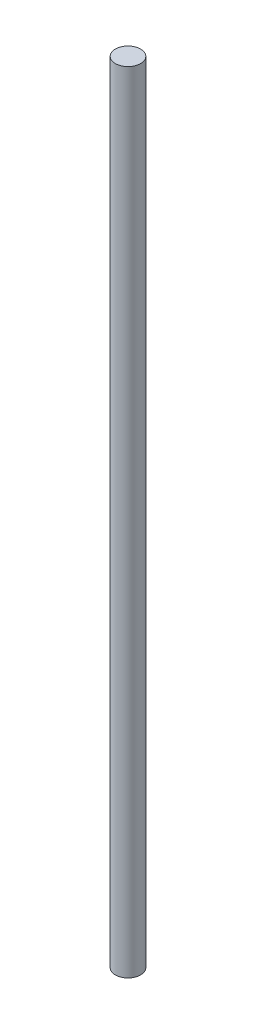
ISO-10303-21;
HEADER;
FILE_DESCRIPTION(('STEP AP214'),'2;1');
FILE_NAME('part.step','',(''),(''),'','','');
FILE_SCHEMA(('AUTOMOTIVE_DESIGN { 1 0 10303 214 1 1 1 1 }'));
ENDSEC;
DATA;
#1=APPLICATION_CONTEXT('core data for automotive mechanical design processes');
#2=APPLICATION_PROTOCOL_DEFINITION('international standard','automotive_design',2000,#1);
#3=PRODUCT_CONTEXT('',#1,'mechanical');
#4=PRODUCT('Part','Part','',(#3));
#5=PRODUCT_RELATED_PRODUCT_CATEGORY('part','',(#4));
#6=PRODUCT_DEFINITION_FORMATION('','',#4);
#7=PRODUCT_DEFINITION_CONTEXT('part definition',#1,'design');
#8=PRODUCT_DEFINITION('design','',#6,#7);
#9=PRODUCT_DEFINITION_SHAPE('','',#8);
#10=(LENGTH_UNIT() NAMED_UNIT(*) SI_UNIT(.MILLI.,.METRE.));
#11=(NAMED_UNIT(*) PLANE_ANGLE_UNIT() SI_UNIT($,.RADIAN.));
#12=(NAMED_UNIT(*) SI_UNIT($,.STERADIAN.) SOLID_ANGLE_UNIT());
#13=UNCERTAINTY_MEASURE_WITH_UNIT(LENGTH_MEASURE(1.E-05),#10,'distance_accuracy_value','');
#14=(GEOMETRIC_REPRESENTATION_CONTEXT(3) GLOBAL_UNCERTAINTY_ASSIGNED_CONTEXT((#13)) GLOBAL_UNIT_ASSIGNED_CONTEXT((#10,
#11,#12)) REPRESENTATION_CONTEXT('',''));
#15=CARTESIAN_POINT('',(0.,0.,0.));
#16=DIRECTION('',(0.,0.,1.));
#17=DIRECTION('',(1.,0.,0.));
#18=AXIS2_PLACEMENT_3D('',#15,#16,#17);
#19=CARTESIAN_POINT('',(0.,36.,0.));
#20=DIRECTION('',(0.,-1.,0.));
#21=DIRECTION('',(0.,0.,-1.));
#22=AXIS2_PLACEMENT_3D('',#19,#20,#21);
#23=CYLINDRICAL_SURFACE('',#22,0.575);
#24=CARTESIAN_POINT('',(0.,36.,0.));
#25=DIRECTION('',(0.,1.,0.));
#26=DIRECTION('',(0.,0.,1.));
#27=AXIS2_PLACEMENT_3D('',#24,#25,#26);
#28=CIRCLE('',#27,0.575);
#29=CARTESIAN_POINT('',(0.,36.,0.575));
#30=VERTEX_POINT('',#29);
#31=EDGE_CURVE('E10',#30,#30,#28,.T.);
#32=ORIENTED_EDGE('',*,*,#31,.F.);
#33=EDGE_LOOP('',(#32));
#34=FACE_BOUND('',#33,.T.);
#35=CARTESIAN_POINT('',(0.,0.,0.));
#36=DIRECTION('',(0.,1.,0.));
#37=DIRECTION('',(0.,0.,1.));
#38=AXIS2_PLACEMENT_3D('',#35,#36,#37);
#39=CIRCLE('',#38,0.575);
#40=CARTESIAN_POINT('',(0.,0.,0.575));
#41=VERTEX_POINT('',#40);
#42=EDGE_CURVE('E32',#41,#41,#39,.T.);
#43=ORIENTED_EDGE('',*,*,#42,.T.);
#44=EDGE_LOOP('',(#43));
#45=FACE_BOUND('',#44,.T.);
#46=ADVANCED_FACE('F29',(#34,#45),#23,.T.);
#47=CARTESIAN_POINT('',(0.,36.,0.));
#48=DIRECTION('',(0.,1.,0.));
#49=DIRECTION('',(0.,0.,1.));
#50=AXIS2_PLACEMENT_3D('',#47,#48,#49);
#51=PLANE('',#50);
#52=ORIENTED_EDGE('',*,*,#31,.T.);
#53=EDGE_LOOP('',(#52));
#54=FACE_BOUND('',#53,.T.);
#55=ADVANCED_FACE('F44',(#54),#51,.T.);
#56=CARTESIAN_POINT('',(0.,0.,0.));
#57=DIRECTION('',(0.,1.,0.));
#58=DIRECTION('',(0.,0.,1.));
#59=AXIS2_PLACEMENT_3D('',#56,#57,#58);
#60=PLANE('',#59);
#61=ORIENTED_EDGE('',*,*,#42,.F.);
#62=EDGE_LOOP('',(#61));
#63=FACE_BOUND('',#62,.T.);
#64=ADVANCED_FACE('F42',(#63),#60,.F.);
#65=CLOSED_SHELL('',(#46,#55,#64));
#66=MANIFOLD_SOLID_BREP('B2',#65);
#67=ADVANCED_BREP_SHAPE_REPRESENTATION('',(#18,#66),#14);
#68=SHAPE_DEFINITION_REPRESENTATION(#9,#67);
ENDSEC;
END-ISO-10303-21;
